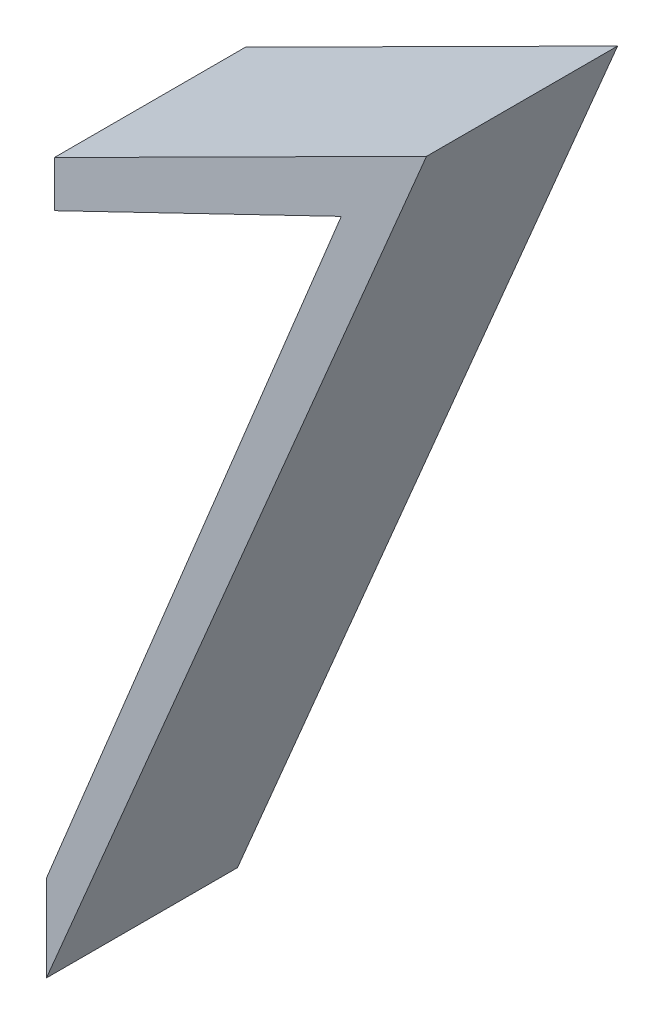
ISO-10303-21;
HEADER;
FILE_DESCRIPTION(('STEP AP214'),'2;1');
FILE_NAME('part.step','',(''),(''),'','','');
FILE_SCHEMA(('AUTOMOTIVE_DESIGN { 1 0 10303 214 1 1 1 1 }'));
ENDSEC;
DATA;
#1=APPLICATION_CONTEXT('core data for automotive mechanical design processes');
#2=APPLICATION_PROTOCOL_DEFINITION('international standard','automotive_design',2000,#1);
#3=PRODUCT_CONTEXT('',#1,'mechanical');
#4=PRODUCT('Part','Part','',(#3));
#5=PRODUCT_RELATED_PRODUCT_CATEGORY('part','',(#4));
#6=PRODUCT_DEFINITION_FORMATION('','',#4);
#7=PRODUCT_DEFINITION_CONTEXT('part definition',#1,'design');
#8=PRODUCT_DEFINITION('design','',#6,#7);
#9=PRODUCT_DEFINITION_SHAPE('','',#8);
#10=(LENGTH_UNIT() NAMED_UNIT(*) SI_UNIT(.MILLI.,.METRE.));
#11=(NAMED_UNIT(*) PLANE_ANGLE_UNIT() SI_UNIT($,.RADIAN.));
#12=(NAMED_UNIT(*) SI_UNIT($,.STERADIAN.) SOLID_ANGLE_UNIT());
#13=UNCERTAINTY_MEASURE_WITH_UNIT(LENGTH_MEASURE(1.E-05),#10,'distance_accuracy_value','');
#14=(GEOMETRIC_REPRESENTATION_CONTEXT(3) GLOBAL_UNCERTAINTY_ASSIGNED_CONTEXT((#13)) GLOBAL_UNIT_ASSIGNED_CONTEXT((#10,
#11,#12)) REPRESENTATION_CONTEXT('',''));
#15=CARTESIAN_POINT('',(0.,0.,0.));
#16=DIRECTION('',(0.,0.,1.));
#17=DIRECTION('',(1.,0.,0.));
#18=AXIS2_PLACEMENT_3D('',#15,#16,#17);
#19=CARTESIAN_POINT('',(-6.81191713783846,23.223438247363,5.));
#20=DIRECTION('',(1.,0.,0.));
#21=DIRECTION('',(0.,0.,-1.));
#22=AXIS2_PLACEMENT_3D('',#19,#20,#21);
#23=PLANE('',#22);
#24=DIRECTION('',(0.,-1.,0.));
#25=VECTOR('',#24,1.);
#26=CARTESIAN_POINT('',(-6.81191713783846,23.223438247363,0.));
#27=LINE('',#26,#25);
#28=CARTESIAN_POINT('',(-6.81191713783846,24.4280368344221,0.));
#29=VERTEX_POINT('',#28);
#30=CARTESIAN_POINT('',(-6.81191713783846,23.223438247363,0.));
#31=VERTEX_POINT('',#30);
#32=EDGE_CURVE('E117',#29,#31,#27,.T.);
#33=ORIENTED_EDGE('',*,*,#32,.T.);
#34=DIRECTION('',(0.,0.,-1.));
#35=VECTOR('',#34,1.);
#36=CARTESIAN_POINT('',(-6.81191713783846,23.223438247363,5.));
#37=LINE('',#36,#35);
#38=CARTESIAN_POINT('',(-6.81191713783846,23.223438247363,5.));
#39=VERTEX_POINT('',#38);
#40=EDGE_CURVE('E11',#39,#31,#37,.T.);
#41=ORIENTED_EDGE('',*,*,#40,.F.);
#42=DIRECTION('',(0.,-1.,0.));
#43=VECTOR('',#42,1.);
#44=CARTESIAN_POINT('',(-6.81191713783846,23.223438247363,5.));
#45=LINE('',#44,#43);
#46=CARTESIAN_POINT('',(-6.81191713783846,24.4280368344221,5.));
#47=VERTEX_POINT('',#46);
#48=EDGE_CURVE('E127',#47,#39,#45,.T.);
#49=ORIENTED_EDGE('',*,*,#48,.F.);
#50=DIRECTION('',(0.,0.,-1.));
#51=VECTOR('',#50,1.);
#52=CARTESIAN_POINT('',(-6.81191713783846,24.4280368344221,5.));
#53=LINE('',#52,#51);
#54=EDGE_CURVE('E113',#47,#29,#53,.T.);
#55=ORIENTED_EDGE('',*,*,#54,.T.);
#56=EDGE_LOOP('',(#33,#41,#49,#55));
#57=FACE_BOUND('',#56,.T.);
#58=ADVANCED_FACE('F33',(#57),#23,.F.);
#59=CARTESIAN_POINT('',(0.695985399215004,26.8483048989978,5.));
#60=DIRECTION('',(-0.43478427678595,0.900534637123814,0.));
#61=DIRECTION('',(-0.900534637123814,-0.43478427678595,0.));
#62=AXIS2_PLACEMENT_3D('',#59,#60,#61);
#63=PLANE('',#62);
#64=DIRECTION('',(0.900534637123814,0.43478427678595,0.));
#65=VECTOR('',#64,1.);
#66=CARTESIAN_POINT('',(0.695985399215004,26.8483048989978,0.));
#67=LINE('',#66,#65);
#68=CARTESIAN_POINT('',(0.695985399215004,26.8483048989978,0.));
#69=VERTEX_POINT('',#68);
#70=EDGE_CURVE('E120',#31,#69,#67,.T.);
#71=ORIENTED_EDGE('',*,*,#70,.T.);
#72=DIRECTION('',(0.,0.,-1.));
#73=VECTOR('',#72,1.);
#74=CARTESIAN_POINT('',(0.695985399215004,26.8483048989978,5.));
#75=LINE('',#74,#73);
#76=CARTESIAN_POINT('',(0.695985399215004,26.8483048989978,5.));
#77=VERTEX_POINT('',#76);
#78=EDGE_CURVE('E41',#77,#69,#75,.T.);
#79=ORIENTED_EDGE('',*,*,#78,.F.);
#80=DIRECTION('',(0.900534637123814,0.43478427678595,0.));
#81=VECTOR('',#80,1.);
#82=CARTESIAN_POINT('',(0.695985399215004,26.8483048989978,5.));
#83=LINE('',#82,#81);
#84=EDGE_CURVE('E86',#39,#77,#83,.T.);
#85=ORIENTED_EDGE('',*,*,#84,.F.);
#86=ORIENTED_EDGE('',*,*,#40,.T.);
#87=EDGE_LOOP('',(#71,#79,#85,#86));
#88=FACE_BOUND('',#87,.T.);
#89=ADVANCED_FACE('F151',(#88),#63,.F.);
#90=CARTESIAN_POINT('',(-7.02045433313003,7.99391676440564,5.));
#91=DIRECTION('',(0.925490507369118,-0.378770802424966,0.));
#92=DIRECTION('',(0.378770802424966,0.925490507369118,0.));
#93=AXIS2_PLACEMENT_3D('',#90,#91,#92);
#94=PLANE('',#93);
#95=DIRECTION('',(-0.378770802424966,-0.925490507369118,0.));
#96=VECTOR('',#95,1.);
#97=CARTESIAN_POINT('',(-7.02045433313003,7.99391676440564,0.));
#98=LINE('',#97,#96);
#99=CARTESIAN_POINT('',(-7.02045433313003,7.99391676440564,0.));
#100=VERTEX_POINT('',#99);
#101=EDGE_CURVE('E122',#69,#100,#98,.T.);
#102=ORIENTED_EDGE('',*,*,#101,.T.);
#103=DIRECTION('',(0.,0.,-1.));
#104=VECTOR('',#103,1.);
#105=CARTESIAN_POINT('',(-7.02045433313003,7.99391676440564,5.));
#106=LINE('',#105,#104);
#107=CARTESIAN_POINT('',(-7.02045433313003,7.99391676440564,5.));
#108=VERTEX_POINT('',#107);
#109=EDGE_CURVE('E108',#108,#100,#106,.T.);
#110=ORIENTED_EDGE('',*,*,#109,.F.);
#111=DIRECTION('',(-0.378770802424966,-0.925490507369118,0.));
#112=VECTOR('',#111,1.);
#113=CARTESIAN_POINT('',(-7.02045433313003,7.99391676440564,5.));
#114=LINE('',#113,#112);
#115=EDGE_CURVE('E99',#77,#108,#114,.T.);
#116=ORIENTED_EDGE('',*,*,#115,.F.);
#117=ORIENTED_EDGE('',*,*,#78,.T.);
#118=EDGE_LOOP('',(#102,#110,#116,#117));
#119=FACE_BOUND('',#118,.T.);
#120=ADVANCED_FACE('F133',(#119),#94,.F.);
#121=CARTESIAN_POINT('',(-7.02045433313003,5.73273411480812,5.));
#122=DIRECTION('',(1.,0.,0.));
#123=DIRECTION('',(0.,0.,-1.));
#124=AXIS2_PLACEMENT_3D('',#121,#122,#123);
#125=PLANE('',#124);
#126=DIRECTION('',(0.,-1.,0.));
#127=VECTOR('',#126,1.);
#128=CARTESIAN_POINT('',(-7.02045433313003,5.73273411480812,0.));
#129=LINE('',#128,#127);
#130=CARTESIAN_POINT('',(-7.02045433313003,5.73273411480812,0.));
#131=VERTEX_POINT('',#130);
#132=EDGE_CURVE('E107',#100,#131,#129,.T.);
#133=ORIENTED_EDGE('',*,*,#132,.T.);
#134=DIRECTION('',(0.,0.,-1.));
#135=VECTOR('',#134,1.);
#136=CARTESIAN_POINT('',(-7.02045433313003,5.73273411480812,5.));
#137=LINE('',#136,#135);
#138=CARTESIAN_POINT('',(-7.02045433313003,5.73273411480812,5.));
#139=VERTEX_POINT('',#138);
#140=EDGE_CURVE('E104',#139,#131,#137,.T.);
#141=ORIENTED_EDGE('',*,*,#140,.F.);
#142=DIRECTION('',(0.,-1.,0.));
#143=VECTOR('',#142,1.);
#144=CARTESIAN_POINT('',(-7.02045433313003,5.73273411480812,5.));
#145=LINE('',#144,#143);
#146=EDGE_CURVE('E93',#108,#139,#145,.T.);
#147=ORIENTED_EDGE('',*,*,#146,.F.);
#148=ORIENTED_EDGE('',*,*,#109,.T.);
#149=EDGE_LOOP('',(#133,#141,#147,#148));
#150=FACE_BOUND('',#149,.T.);
#151=ADVANCED_FACE('F105',(#150),#125,.F.);
#152=CARTESIAN_POINT('',(2.92517909967138,29.3234620321527,5.));
#153=DIRECTION('',(-0.921457927770077,0.388478168433793,0.));
#154=DIRECTION('',(-0.388478168433793,-0.921457927770078,0.));
#155=AXIS2_PLACEMENT_3D('',#152,#153,#154);
#156=PLANE('',#155);
#157=DIRECTION('',(0.388478168433793,0.921457927770077,0.));
#158=VECTOR('',#157,1.);
#159=CARTESIAN_POINT('',(2.92517909967138,29.3234620321527,0.));
#160=LINE('',#159,#158);
#161=CARTESIAN_POINT('',(2.92517909967138,29.3234620321527,0.));
#162=VERTEX_POINT('',#161);
#163=EDGE_CURVE('E72',#131,#162,#160,.T.);
#164=ORIENTED_EDGE('',*,*,#163,.T.);
#165=DIRECTION('',(0.,0.,-1.));
#166=VECTOR('',#165,1.);
#167=CARTESIAN_POINT('',(2.92517909967138,29.3234620321527,5.));
#168=LINE('',#167,#166);
#169=CARTESIAN_POINT('',(2.92517909967138,29.3234620321527,5.));
#170=VERTEX_POINT('',#169);
#171=EDGE_CURVE('E109',#170,#162,#168,.T.);
#172=ORIENTED_EDGE('',*,*,#171,.F.);
#173=DIRECTION('',(0.388478168433793,0.921457927770077,0.));
#174=VECTOR('',#173,1.);
#175=CARTESIAN_POINT('',(2.92517909967138,29.3234620321527,5.));
#176=LINE('',#175,#174);
#177=EDGE_CURVE('E97',#139,#170,#176,.T.);
#178=ORIENTED_EDGE('',*,*,#177,.F.);
#179=ORIENTED_EDGE('',*,*,#140,.T.);
#180=EDGE_LOOP('',(#164,#172,#178,#179));
#181=FACE_BOUND('',#180,.T.);
#182=ADVANCED_FACE('F111',(#181),#156,.F.);
#183=CARTESIAN_POINT('',(-6.81191713783846,24.4280368344221,5.));
#184=DIRECTION('',(0.449185417593562,-0.893438560070751,0.));
#185=DIRECTION('',(0.893438560070751,0.449185417593562,0.));
#186=AXIS2_PLACEMENT_3D('',#183,#184,#185);
#187=PLANE('',#186);
#188=DIRECTION('',(-0.893438560070751,-0.449185417593562,0.));
#189=VECTOR('',#188,1.);
#190=CARTESIAN_POINT('',(-6.81191713783846,24.4280368344221,0.));
#191=LINE('',#190,#189);
#192=EDGE_CURVE('E78',#162,#29,#191,.T.);
#193=ORIENTED_EDGE('',*,*,#192,.T.);
#194=ORIENTED_EDGE('',*,*,#54,.F.);
#195=DIRECTION('',(-0.893438560070751,-0.449185417593562,0.));
#196=VECTOR('',#195,1.);
#197=CARTESIAN_POINT('',(-6.81191713783846,24.4280368344221,5.));
#198=LINE('',#197,#196);
#199=EDGE_CURVE('E49',#170,#47,#198,.T.);
#200=ORIENTED_EDGE('',*,*,#199,.F.);
#201=ORIENTED_EDGE('',*,*,#171,.T.);
#202=EDGE_LOOP('',(#193,#194,#200,#201));
#203=FACE_BOUND('',#202,.T.);
#204=ADVANCED_FACE('F140',(#203),#187,.F.);
#205=CARTESIAN_POINT('',(0.,0.,5.));
#206=DIRECTION('',(0.,0.,1.));
#207=DIRECTION('',(1.,0.,0.));
#208=AXIS2_PLACEMENT_3D('',#205,#206,#207);
#209=PLANE('',#208);
#210=ORIENTED_EDGE('',*,*,#48,.T.);
#211=ORIENTED_EDGE('',*,*,#84,.T.);
#212=ORIENTED_EDGE('',*,*,#115,.T.);
#213=ORIENTED_EDGE('',*,*,#146,.T.);
#214=ORIENTED_EDGE('',*,*,#177,.T.);
#215=ORIENTED_EDGE('',*,*,#199,.T.);
#216=EDGE_LOOP('',(#210,#211,#212,#213,#214,#215));
#217=FACE_BOUND('',#216,.T.);
#218=ADVANCED_FACE('F95',(#217),#209,.T.);
#219=CARTESIAN_POINT('',(0.,0.,0.));
#220=DIRECTION('',(0.,0.,1.));
#221=DIRECTION('',(1.,0.,0.));
#222=AXIS2_PLACEMENT_3D('',#219,#220,#221);
#223=PLANE('',#222);
#224=ORIENTED_EDGE('',*,*,#32,.F.);
#225=ORIENTED_EDGE('',*,*,#192,.F.);
#226=ORIENTED_EDGE('',*,*,#163,.F.);
#227=ORIENTED_EDGE('',*,*,#132,.F.);
#228=ORIENTED_EDGE('',*,*,#101,.F.);
#229=ORIENTED_EDGE('',*,*,#70,.F.);
#230=EDGE_LOOP('',(#224,#225,#226,#227,#228,#229));
#231=FACE_BOUND('',#230,.T.);
#232=ADVANCED_FACE('F136',(#231),#223,.F.);
#233=CLOSED_SHELL('',(#58,#89,#120,#151,#182,#204,#218,#232));
#234=MANIFOLD_SOLID_BREP('B2',#233);
#235=ADVANCED_BREP_SHAPE_REPRESENTATION('',(#18,#234),#14);
#236=SHAPE_DEFINITION_REPRESENTATION(#9,#235);
ENDSEC;
END-ISO-10303-21;
